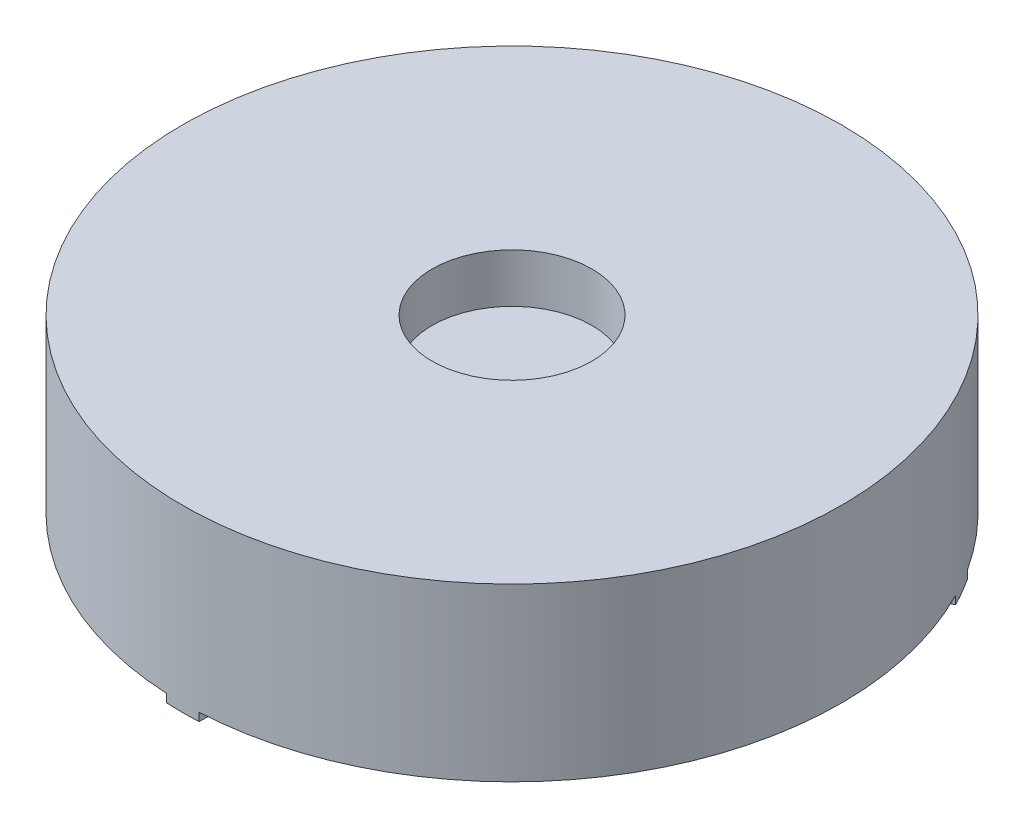
ISO-10303-21;
HEADER;
FILE_DESCRIPTION(('STEP AP214'),'2;1');
FILE_NAME('part.step','',(''),(''),'','','');
FILE_SCHEMA(('AUTOMOTIVE_DESIGN { 1 0 10303 214 1 1 1 1 }'));
ENDSEC;
DATA;
#1=APPLICATION_CONTEXT('core data for automotive mechanical design processes');
#2=APPLICATION_PROTOCOL_DEFINITION('international standard','automotive_design',2000,#1);
#3=PRODUCT_CONTEXT('',#1,'mechanical');
#4=PRODUCT('Part','Part','',(#3));
#5=PRODUCT_RELATED_PRODUCT_CATEGORY('part','',(#4));
#6=PRODUCT_DEFINITION_FORMATION('','',#4);
#7=PRODUCT_DEFINITION_CONTEXT('part definition',#1,'design');
#8=PRODUCT_DEFINITION('design','',#6,#7);
#9=PRODUCT_DEFINITION_SHAPE('','',#8);
#10=(LENGTH_UNIT() NAMED_UNIT(*) SI_UNIT(.MILLI.,.METRE.));
#11=(NAMED_UNIT(*) PLANE_ANGLE_UNIT() SI_UNIT($,.RADIAN.));
#12=(NAMED_UNIT(*) SI_UNIT($,.STERADIAN.) SOLID_ANGLE_UNIT());
#13=UNCERTAINTY_MEASURE_WITH_UNIT(LENGTH_MEASURE(1.E-05),#10,'distance_accuracy_value','');
#14=(GEOMETRIC_REPRESENTATION_CONTEXT(3) GLOBAL_UNCERTAINTY_ASSIGNED_CONTEXT((#13)) GLOBAL_UNIT_ASSIGNED_CONTEXT((#10,
#11,#12)) REPRESENTATION_CONTEXT('',''));
#15=CARTESIAN_POINT('',(0.,0.,0.));
#16=DIRECTION('',(0.,0.,1.));
#17=DIRECTION('',(1.,0.,0.));
#18=AXIS2_PLACEMENT_3D('',#15,#16,#17);
#19=CARTESIAN_POINT('',(0.,0.,-20.2));
#20=DIRECTION('',(0.,-1.,0.));
#21=DIRECTION('',(0.,0.,-1.));
#22=AXIS2_PLACEMENT_3D('',#19,#20,#21);
#23=PLANE('',#22);
#24=CARTESIAN_POINT('',(0.,0.,-14.5));
#25=DIRECTION('',(0.,-1.,0.));
#26=DIRECTION('',(0.,0.,-1.));
#27=AXIS2_PLACEMENT_3D('',#24,#25,#26);
#28=CIRCLE('',#27,0.5);
#29=CARTESIAN_POINT('',(0.,0.,-15.));
#30=VERTEX_POINT('',#29);
#31=EDGE_CURVE('E326',#30,#30,#28,.T.);
#32=ORIENTED_EDGE('',*,*,#31,.F.);
#33=EDGE_LOOP('',(#32));
#34=FACE_BOUND('',#33,.T.);
#35=CARTESIAN_POINT('',(0.,0.,4.));
#36=DIRECTION('',(0.,-1.,0.));
#37=DIRECTION('',(0.,0.,-1.));
#38=AXIS2_PLACEMENT_3D('',#35,#36,#37);
#39=CIRCLE('',#38,0.5);
#40=CARTESIAN_POINT('',(0.,0.,3.5));
#41=VERTEX_POINT('',#40);
#42=EDGE_CURVE('E317',#41,#41,#39,.T.);
#43=ORIENTED_EDGE('',*,*,#42,.F.);
#44=EDGE_LOOP('',(#43));
#45=FACE_BOUND('',#44,.T.);
#46=CARTESIAN_POINT('',(0.,0.,0.));
#47=DIRECTION('',(0.,1.,0.));
#48=DIRECTION('',(0.,0.,-1.));
#49=AXIS2_PLACEMENT_3D('',#46,#47,#48);
#50=CIRCLE('',#49,19.2);
#51=CARTESIAN_POINT('',(-16.1051196924323,0.,-10.452995728136));
#52=VERTEX_POINT('',#51);
#53=CARTESIAN_POINT('',(-17.1051196924323,0.,-8.72094492056709));
#54=VERTEX_POINT('',#53);
#55=EDGE_CURVE('E55',#52,#54,#50,.T.);
#56=ORIENTED_EDGE('',*,*,#55,.F.);
#57=DIRECTION('',(0.866025403784443,0.,0.499999999999992));
#58=VECTOR('',#57,1.);
#59=CARTESIAN_POINT('',(-16.9722637342733,0.,-10.9536415741191));
#60=LINE('',#59,#58);
#61=CARTESIAN_POINT('',(-16.9722637342733,0.,-10.9536415741191));
#62=VERTEX_POINT('',#61);
#63=EDGE_CURVE('E303',#62,#52,#60,.T.);
#64=ORIENTED_EDGE('',*,*,#63,.F.);
#65=CARTESIAN_POINT('',(0.,0.,0.));
#66=DIRECTION('',(0.,-1.,0.));
#67=DIRECTION('',(0.,0.,-1.));
#68=AXIS2_PLACEMENT_3D('',#65,#66,#67);
#69=CIRCLE('',#68,20.2);
#70=CARTESIAN_POINT('',(16.9722637342732,0.,-10.9536415741193));
#71=VERTEX_POINT('',#70);
#72=EDGE_CURVE('E153',#62,#71,#69,.T.);
#73=ORIENTED_EDGE('',*,*,#72,.T.);
#74=DIRECTION('',(0.866025403784436,0.,-0.500000000000005));
#75=VECTOR('',#74,1.);
#76=CARTESIAN_POINT('',(16.9722637342732,0.,-10.9536415741193));
#77=LINE('',#76,#75);
#78=CARTESIAN_POINT('',(16.1051196924322,0.,-10.4529957281362));
#79=VERTEX_POINT('',#78);
#80=EDGE_CURVE('E170',#79,#71,#77,.T.);
#81=ORIENTED_EDGE('',*,*,#80,.F.);
#82=CARTESIAN_POINT('',(0.,0.,0.));
#83=DIRECTION('',(0.,1.,0.));
#84=DIRECTION('',(0.,0.,-1.));
#85=AXIS2_PLACEMENT_3D('',#82,#83,#84);
#86=CIRCLE('',#85,19.2);
#87=CARTESIAN_POINT('',(17.1051196924322,0.,-8.72094492056734));
#88=VERTEX_POINT('',#87);
#89=EDGE_CURVE('E159',#88,#79,#86,.T.);
#90=ORIENTED_EDGE('',*,*,#89,.F.);
#91=DIRECTION('',(-0.866025403784436,0.,0.500000000000005));
#92=VECTOR('',#91,1.);
#93=CARTESIAN_POINT('',(17.9722637342732,0.,-9.22159076655044));
#94=LINE('',#93,#92);
#95=CARTESIAN_POINT('',(17.9722637342732,0.,-9.22159076655044));
#96=VERTEX_POINT('',#95);
#97=EDGE_CURVE('E155',#96,#88,#94,.T.);
#98=ORIENTED_EDGE('',*,*,#97,.F.);
#99=CARTESIAN_POINT('',(1.,0.,20.1752323406696));
#100=VERTEX_POINT('',#99);
#101=EDGE_CURVE('E239',#96,#100,#69,.T.);
#102=ORIENTED_EDGE('',*,*,#101,.T.);
#103=DIRECTION('',(0.,0.,1.));
#104=VECTOR('',#103,1.);
#105=CARTESIAN_POINT('',(1.,0.,20.1752323406696));
#106=LINE('',#105,#104);
#107=CARTESIAN_POINT('',(1.,0.,19.1739406487034));
#108=VERTEX_POINT('',#107);
#109=EDGE_CURVE('E204',#108,#100,#106,.T.);
#110=ORIENTED_EDGE('',*,*,#109,.F.);
#111=CARTESIAN_POINT('',(0.,0.,0.));
#112=DIRECTION('',(0.,1.,0.));
#113=DIRECTION('',(0.,0.,-1.));
#114=AXIS2_PLACEMENT_3D('',#111,#112,#113);
#115=CIRCLE('',#114,19.2);
#116=CARTESIAN_POINT('',(-1.,0.,19.1739406487034));
#117=VERTEX_POINT('',#116);
#118=EDGE_CURVE('E217',#117,#108,#115,.T.);
#119=ORIENTED_EDGE('',*,*,#118,.F.);
#120=DIRECTION('',(0.,0.,-1.));
#121=VECTOR('',#120,1.);
#122=CARTESIAN_POINT('',(-1.,0.,20.1752323406696));
#123=LINE('',#122,#121);
#124=CARTESIAN_POINT('',(-1.,0.,20.1752323406696));
#125=VERTEX_POINT('',#124);
#126=EDGE_CURVE('E198',#125,#117,#123,.T.);
#127=ORIENTED_EDGE('',*,*,#126,.F.);
#128=CARTESIAN_POINT('',(-17.9722637342733,0.,-9.22159076655018));
#129=VERTEX_POINT('',#128);
#130=EDGE_CURVE('E240',#125,#129,#69,.T.);
#131=ORIENTED_EDGE('',*,*,#130,.T.);
#132=DIRECTION('',(-0.866025403784444,0.,-0.499999999999991));
#133=VECTOR('',#132,1.);
#134=CARTESIAN_POINT('',(-17.9722637342733,0.,-9.22159076655018));
#135=LINE('',#134,#133);
#136=EDGE_CURVE('E60',#54,#129,#135,.T.);
#137=ORIENTED_EDGE('',*,*,#136,.F.);
#138=EDGE_LOOP('',(#56,#64,#73,#81,#90,#98,#102,#110,#119,#127,#131,#137));
#139=FACE_BOUND('',#138,.T.);
#140=ADVANCED_FACE('F39',(#34,#45,#139),#23,.T.);
#141=CARTESIAN_POINT('',(0.,7.5,0.));
#142=DIRECTION('',(0.,1.,0.));
#143=DIRECTION('',(0.,0.,1.));
#144=AXIS2_PLACEMENT_3D('',#141,#142,#143);
#145=PLANE('',#144);
#146=CARTESIAN_POINT('',(0.,7.5,0.));
#147=DIRECTION('',(0.,-1.,0.));
#148=DIRECTION('',(0.,0.,-1.));
#149=AXIS2_PLACEMENT_3D('',#146,#147,#148);
#150=CIRCLE('',#149,4.9);
#151=CARTESIAN_POINT('',(0.,7.5,-4.9));
#152=VERTEX_POINT('',#151);
#153=EDGE_CURVE('E11',#152,#152,#150,.T.);
#154=ORIENTED_EDGE('',*,*,#153,.F.);
#155=EDGE_LOOP('',(#154));
#156=FACE_BOUND('',#155,.T.);
#157=ADVANCED_FACE('F41',(#156),#145,.T.);
#158=CARTESIAN_POINT('',(0.,0.,0.));
#159=DIRECTION('',(0.,-1.,0.));
#160=DIRECTION('',(0.,0.,-1.));
#161=AXIS2_PLACEMENT_3D('',#158,#159,#160);
#162=CYLINDRICAL_SURFACE('',#161,4.9);
#163=ORIENTED_EDGE('',*,*,#153,.T.);
#164=EDGE_LOOP('',(#163));
#165=FACE_BOUND('',#164,.T.);
#166=CARTESIAN_POINT('',(0.,10.5,0.));
#167=DIRECTION('',(0.,-1.,0.));
#168=DIRECTION('',(0.,0.,-1.));
#169=AXIS2_PLACEMENT_3D('',#166,#167,#168);
#170=CIRCLE('',#169,4.9);
#171=CARTESIAN_POINT('',(0.,10.5,-4.9));
#172=VERTEX_POINT('',#171);
#173=EDGE_CURVE('E48',#172,#172,#170,.T.);
#174=ORIENTED_EDGE('',*,*,#173,.F.);
#175=EDGE_LOOP('',(#174));
#176=FACE_BOUND('',#175,.T.);
#177=ADVANCED_FACE('F253',(#165,#176),#162,.F.);
#178=CARTESIAN_POINT('',(0.,10.5,-4.9));
#179=DIRECTION('',(0.,1.,0.));
#180=DIRECTION('',(0.,0.,1.));
#181=AXIS2_PLACEMENT_3D('',#178,#179,#180);
#182=PLANE('',#181);
#183=ORIENTED_EDGE('',*,*,#173,.T.);
#184=EDGE_LOOP('',(#183));
#185=FACE_BOUND('',#184,.T.);
#186=CARTESIAN_POINT('',(0.,10.5,0.));
#187=DIRECTION('',(0.,-1.,0.));
#188=DIRECTION('',(0.,0.,-1.));
#189=AXIS2_PLACEMENT_3D('',#186,#187,#188);
#190=CIRCLE('',#189,20.2);
#191=CARTESIAN_POINT('',(0.,10.5,-20.2));
#192=VERTEX_POINT('',#191);
#193=EDGE_CURVE('E243',#192,#192,#190,.T.);
#194=ORIENTED_EDGE('',*,*,#193,.F.);
#195=EDGE_LOOP('',(#194));
#196=FACE_BOUND('',#195,.T.);
#197=ADVANCED_FACE('F250',(#185,#196),#182,.T.);
#198=CARTESIAN_POINT('',(0.,0.,0.));
#199=DIRECTION('',(0.,-1.,0.));
#200=DIRECTION('',(0.,0.,-1.));
#201=AXIS2_PLACEMENT_3D('',#198,#199,#200);
#202=CYLINDRICAL_SURFACE('',#201,20.2);
#203=ORIENTED_EDGE('',*,*,#193,.T.);
#204=EDGE_LOOP('',(#203));
#205=FACE_BOUND('',#204,.T.);
#206=ORIENTED_EDGE('',*,*,#130,.F.);
#207=DIRECTION('',(0.,1.,0.));
#208=VECTOR('',#207,1.);
#209=CARTESIAN_POINT('',(-1.,-0.5,20.1752323406696));
#210=LINE('',#209,#208);
#211=CARTESIAN_POINT('',(-1.,-0.5,20.1752323406696));
#212=VERTEX_POINT('',#211);
#213=EDGE_CURVE('E235',#212,#125,#210,.T.);
#214=ORIENTED_EDGE('',*,*,#213,.F.);
#215=CARTESIAN_POINT('',(0.,-0.5,0.));
#216=DIRECTION('',(0.,-1.,0.));
#217=DIRECTION('',(0.,0.,-1.));
#218=AXIS2_PLACEMENT_3D('',#215,#216,#217);
#219=CIRCLE('',#218,20.2);
#220=CARTESIAN_POINT('',(1.,-0.5,20.1752323406696));
#221=VERTEX_POINT('',#220);
#222=EDGE_CURVE('E199',#221,#212,#219,.T.);
#223=ORIENTED_EDGE('',*,*,#222,.F.);
#224=DIRECTION('',(0.,1.,0.));
#225=VECTOR('',#224,1.);
#226=CARTESIAN_POINT('',(1.,-0.5,20.1752323406696));
#227=LINE('',#226,#225);
#228=EDGE_CURVE('E213',#221,#100,#227,.T.);
#229=ORIENTED_EDGE('',*,*,#228,.T.);
#230=ORIENTED_EDGE('',*,*,#101,.F.);
#231=DIRECTION('',(0.,1.,0.));
#232=VECTOR('',#231,1.);
#233=CARTESIAN_POINT('',(17.9722637342732,-0.5,-9.22159076655044));
#234=LINE('',#233,#232);
#235=CARTESIAN_POINT('',(17.9722637342732,-0.5,-9.22159076655044));
#236=VERTEX_POINT('',#235);
#237=EDGE_CURVE('E195',#236,#96,#234,.T.);
#238=ORIENTED_EDGE('',*,*,#237,.F.);
#239=CARTESIAN_POINT('',(0.,-0.5,0.));
#240=DIRECTION('',(0.,-1.,0.));
#241=DIRECTION('',(0.,0.,-1.));
#242=AXIS2_PLACEMENT_3D('',#239,#240,#241);
#243=CIRCLE('',#242,20.2);
#244=CARTESIAN_POINT('',(16.9722637342732,-0.5,-10.9536415741193));
#245=VERTEX_POINT('',#244);
#246=EDGE_CURVE('E165',#245,#236,#243,.T.);
#247=ORIENTED_EDGE('',*,*,#246,.F.);
#248=DIRECTION('',(0.,1.,0.));
#249=VECTOR('',#248,1.);
#250=CARTESIAN_POINT('',(16.9722637342732,-0.5,-10.9536415741193));
#251=LINE('',#250,#249);
#252=EDGE_CURVE('E178',#245,#71,#251,.T.);
#253=ORIENTED_EDGE('',*,*,#252,.T.);
#254=ORIENTED_EDGE('',*,*,#72,.F.);
#255=DIRECTION('',(0.,1.,0.));
#256=VECTOR('',#255,1.);
#257=CARTESIAN_POINT('',(-16.9722637342733,-0.5,-10.9536415741191));
#258=LINE('',#257,#256);
#259=CARTESIAN_POINT('',(-16.9722637342733,-0.5,-10.9536415741191));
#260=VERTEX_POINT('',#259);
#261=EDGE_CURVE('E132',#260,#62,#258,.T.);
#262=ORIENTED_EDGE('',*,*,#261,.F.);
#263=CARTESIAN_POINT('',(0.,-0.5,0.));
#264=DIRECTION('',(0.,-1.,0.));
#265=DIRECTION('',(0.,0.,-1.));
#266=AXIS2_PLACEMENT_3D('',#263,#264,#265);
#267=CIRCLE('',#266,20.2);
#268=CARTESIAN_POINT('',(-17.9722637342733,-0.5,-9.22159076655018));
#269=VERTEX_POINT('',#268);
#270=EDGE_CURVE('E139',#269,#260,#267,.T.);
#271=ORIENTED_EDGE('',*,*,#270,.F.);
#272=DIRECTION('',(0.,1.,0.));
#273=VECTOR('',#272,1.);
#274=CARTESIAN_POINT('',(-17.9722637342733,-0.5,-9.22159076655018));
#275=LINE('',#274,#273);
#276=EDGE_CURVE('E295',#269,#129,#275,.T.);
#277=ORIENTED_EDGE('',*,*,#276,.T.);
#278=EDGE_LOOP('',(#206,#214,#223,#229,#230,#238,#247,#253,#254,#262,#271,#277));
#279=FACE_BOUND('',#278,.T.);
#280=ADVANCED_FACE('F151',(#205,#279),#202,.T.);
#281=CARTESIAN_POINT('',(-1.,-0.5,20.1752323406696));
#282=DIRECTION('',(1.,0.,0.));
#283=DIRECTION('',(0.,0.,-1.));
#284=AXIS2_PLACEMENT_3D('',#281,#282,#283);
#285=PLANE('',#284);
#286=ORIENTED_EDGE('',*,*,#126,.T.);
#287=DIRECTION('',(0.,1.,0.));
#288=VECTOR('',#287,1.);
#289=CARTESIAN_POINT('',(-1.,-0.5,19.1739406487034));
#290=LINE('',#289,#288);
#291=CARTESIAN_POINT('',(-1.,-0.5,19.1739406487034));
#292=VERTEX_POINT('',#291);
#293=EDGE_CURVE('E231',#292,#117,#290,.T.);
#294=ORIENTED_EDGE('',*,*,#293,.F.);
#295=DIRECTION('',(0.,0.,-1.));
#296=VECTOR('',#295,1.);
#297=CARTESIAN_POINT('',(-1.,-0.5,20.1752323406696));
#298=LINE('',#297,#296);
#299=EDGE_CURVE('E203',#212,#292,#298,.T.);
#300=ORIENTED_EDGE('',*,*,#299,.F.);
#301=ORIENTED_EDGE('',*,*,#213,.T.);
#302=EDGE_LOOP('',(#286,#294,#300,#301));
#303=FACE_BOUND('',#302,.T.);
#304=ADVANCED_FACE('F271',(#303),#285,.F.);
#305=CARTESIAN_POINT('',(0.,-0.5,0.));
#306=DIRECTION('',(0.,1.,0.));
#307=DIRECTION('',(0.,0.,1.));
#308=AXIS2_PLACEMENT_3D('',#305,#306,#307);
#309=CYLINDRICAL_SURFACE('',#308,19.2);
#310=ORIENTED_EDGE('',*,*,#118,.T.);
#311=DIRECTION('',(0.,1.,0.));
#312=VECTOR('',#311,1.);
#313=CARTESIAN_POINT('',(1.,-0.5,19.1739406487034));
#314=LINE('',#313,#312);
#315=CARTESIAN_POINT('',(1.,-0.5,19.1739406487034));
#316=VERTEX_POINT('',#315);
#317=EDGE_CURVE('E227',#316,#108,#314,.T.);
#318=ORIENTED_EDGE('',*,*,#317,.F.);
#319=CARTESIAN_POINT('',(0.,-0.5,0.));
#320=DIRECTION('',(0.,1.,0.));
#321=DIRECTION('',(0.,0.,-1.));
#322=AXIS2_PLACEMENT_3D('',#319,#320,#321);
#323=CIRCLE('',#322,19.2);
#324=EDGE_CURVE('E207',#292,#316,#323,.T.);
#325=ORIENTED_EDGE('',*,*,#324,.F.);
#326=ORIENTED_EDGE('',*,*,#293,.T.);
#327=EDGE_LOOP('',(#310,#318,#325,#326));
#328=FACE_BOUND('',#327,.T.);
#329=ADVANCED_FACE('F278',(#328),#309,.F.);
#330=CARTESIAN_POINT('',(1.,-0.5,20.1752323406696));
#331=DIRECTION('',(-1.,0.,0.));
#332=DIRECTION('',(0.,0.,1.));
#333=AXIS2_PLACEMENT_3D('',#330,#331,#332);
#334=PLANE('',#333);
#335=ORIENTED_EDGE('',*,*,#109,.T.);
#336=ORIENTED_EDGE('',*,*,#228,.F.);
#337=DIRECTION('',(0.,0.,1.));
#338=VECTOR('',#337,1.);
#339=CARTESIAN_POINT('',(1.,-0.5,20.1752323406696));
#340=LINE('',#339,#338);
#341=EDGE_CURVE('E210',#316,#221,#340,.T.);
#342=ORIENTED_EDGE('',*,*,#341,.F.);
#343=ORIENTED_EDGE('',*,*,#317,.T.);
#344=EDGE_LOOP('',(#335,#336,#342,#343));
#345=FACE_BOUND('',#344,.T.);
#346=ADVANCED_FACE('F284',(#345),#334,.F.);
#347=CARTESIAN_POINT('',(0.,-0.5,0.));
#348=DIRECTION('',(0.,-1.,0.));
#349=DIRECTION('',(0.,0.,-1.));
#350=AXIS2_PLACEMENT_3D('',#347,#348,#349);
#351=PLANE('',#350);
#352=ORIENTED_EDGE('',*,*,#222,.T.);
#353=ORIENTED_EDGE('',*,*,#299,.T.);
#354=ORIENTED_EDGE('',*,*,#324,.T.);
#355=ORIENTED_EDGE('',*,*,#341,.T.);
#356=EDGE_LOOP('',(#352,#353,#354,#355));
#357=FACE_BOUND('',#356,.T.);
#358=ADVANCED_FACE('F292',(#357),#351,.T.);
#359=CARTESIAN_POINT('',(17.9722637342732,-0.5,-9.22159076655044));
#360=DIRECTION('',(-0.500000000000005,0.,-0.866025403784436));
#361=DIRECTION('',(-0.866025403784436,0.,0.500000000000005));
#362=AXIS2_PLACEMENT_3D('',#359,#360,#361);
#363=PLANE('',#362);
#364=ORIENTED_EDGE('',*,*,#97,.T.);
#365=DIRECTION('',(0.,1.,0.));
#366=VECTOR('',#365,1.);
#367=CARTESIAN_POINT('',(17.1051196924322,-0.5,-8.72094492056734));
#368=LINE('',#367,#366);
#369=CARTESIAN_POINT('',(17.1051196924322,-0.5,-8.72094492056734));
#370=VERTEX_POINT('',#369);
#371=EDGE_CURVE('E191',#370,#88,#368,.T.);
#372=ORIENTED_EDGE('',*,*,#371,.F.);
#373=DIRECTION('',(-0.866025403784436,0.,0.500000000000005));
#374=VECTOR('',#373,1.);
#375=CARTESIAN_POINT('',(17.9722637342732,-0.5,-9.22159076655044));
#376=LINE('',#375,#374);
#377=EDGE_CURVE('E169',#236,#370,#376,.T.);
#378=ORIENTED_EDGE('',*,*,#377,.F.);
#379=ORIENTED_EDGE('',*,*,#237,.T.);
#380=EDGE_LOOP('',(#364,#372,#378,#379));
#381=FACE_BOUND('',#380,.T.);
#382=ADVANCED_FACE('F373',(#381),#363,.F.);
#383=CARTESIAN_POINT('',(0.,-0.5,0.));
#384=DIRECTION('',(0.,1.,0.));
#385=DIRECTION('',(0.,0.,1.));
#386=AXIS2_PLACEMENT_3D('',#383,#384,#385);
#387=CYLINDRICAL_SURFACE('',#386,19.2);
#388=ORIENTED_EDGE('',*,*,#89,.T.);
#389=DIRECTION('',(0.,1.,0.));
#390=VECTOR('',#389,1.);
#391=CARTESIAN_POINT('',(16.1051196924322,-0.5,-10.4529957281362));
#392=LINE('',#391,#390);
#393=CARTESIAN_POINT('',(16.1051196924322,-0.5,-10.4529957281362));
#394=VERTEX_POINT('',#393);
#395=EDGE_CURVE('E188',#394,#79,#392,.T.);
#396=ORIENTED_EDGE('',*,*,#395,.F.);
#397=CARTESIAN_POINT('',(0.,-0.5,0.));
#398=DIRECTION('',(0.,1.,0.));
#399=DIRECTION('',(0.,0.,-1.));
#400=AXIS2_PLACEMENT_3D('',#397,#398,#399);
#401=CIRCLE('',#400,19.2);
#402=EDGE_CURVE('E173',#370,#394,#401,.T.);
#403=ORIENTED_EDGE('',*,*,#402,.F.);
#404=ORIENTED_EDGE('',*,*,#371,.T.);
#405=EDGE_LOOP('',(#388,#396,#403,#404));
#406=FACE_BOUND('',#405,.T.);
#407=ADVANCED_FACE('F369',(#406),#387,.F.);
#408=CARTESIAN_POINT('',(16.9722637342732,-0.5,-10.9536415741193));
#409=DIRECTION('',(0.500000000000005,0.,0.866025403784436));
#410=DIRECTION('',(0.866025403784436,0.,-0.500000000000005));
#411=AXIS2_PLACEMENT_3D('',#408,#409,#410);
#412=PLANE('',#411);
#413=ORIENTED_EDGE('',*,*,#80,.T.);
#414=ORIENTED_EDGE('',*,*,#252,.F.);
#415=DIRECTION('',(0.866025403784436,0.,-0.500000000000005));
#416=VECTOR('',#415,1.);
#417=CARTESIAN_POINT('',(16.9722637342732,-0.5,-10.9536415741193));
#418=LINE('',#417,#416);
#419=EDGE_CURVE('E176',#394,#245,#418,.T.);
#420=ORIENTED_EDGE('',*,*,#419,.F.);
#421=ORIENTED_EDGE('',*,*,#395,.T.);
#422=EDGE_LOOP('',(#413,#414,#420,#421));
#423=FACE_BOUND('',#422,.T.);
#424=ADVANCED_FACE('F365',(#423),#412,.F.);
#425=CARTESIAN_POINT('',(0.,-0.5,0.));
#426=DIRECTION('',(0.,-1.,0.));
#427=DIRECTION('',(0.,0.,-1.));
#428=AXIS2_PLACEMENT_3D('',#425,#426,#427);
#429=PLANE('',#428);
#430=ORIENTED_EDGE('',*,*,#246,.T.);
#431=ORIENTED_EDGE('',*,*,#377,.T.);
#432=ORIENTED_EDGE('',*,*,#402,.T.);
#433=ORIENTED_EDGE('',*,*,#419,.T.);
#434=EDGE_LOOP('',(#430,#431,#432,#433));
#435=FACE_BOUND('',#434,.T.);
#436=ADVANCED_FACE('F362',(#435),#429,.T.);
#437=CARTESIAN_POINT('',(-16.9722637342733,-0.5,-10.9536415741191));
#438=DIRECTION('',(-0.499999999999992,0.,0.866025403784444));
#439=DIRECTION('',(0.866025403784444,0.,0.499999999999992));
#440=AXIS2_PLACEMENT_3D('',#437,#438,#439);
#441=PLANE('',#440);
#442=ORIENTED_EDGE('',*,*,#63,.T.);
#443=DIRECTION('',(0.,1.,0.));
#444=VECTOR('',#443,1.);
#445=CARTESIAN_POINT('',(-16.1051196924323,-0.5,-10.452995728136));
#446=LINE('',#445,#444);
#447=CARTESIAN_POINT('',(-16.1051196924323,-0.5,-10.452995728136));
#448=VERTEX_POINT('',#447);
#449=EDGE_CURVE('E134',#448,#52,#446,.T.);
#450=ORIENTED_EDGE('',*,*,#449,.F.);
#451=DIRECTION('',(0.866025403784443,0.,0.499999999999992));
#452=VECTOR('',#451,1.);
#453=CARTESIAN_POINT('',(-16.9722637342733,-0.5,-10.9536415741191));
#454=LINE('',#453,#452);
#455=EDGE_CURVE('E128',#260,#448,#454,.T.);
#456=ORIENTED_EDGE('',*,*,#455,.F.);
#457=ORIENTED_EDGE('',*,*,#261,.T.);
#458=EDGE_LOOP('',(#442,#450,#456,#457));
#459=FACE_BOUND('',#458,.T.);
#460=ADVANCED_FACE('F130',(#459),#441,.F.);
#461=CARTESIAN_POINT('',(0.,-0.5,0.));
#462=DIRECTION('',(0.,1.,0.));
#463=DIRECTION('',(0.,0.,1.));
#464=AXIS2_PLACEMENT_3D('',#461,#462,#463);
#465=CYLINDRICAL_SURFACE('',#464,19.2);
#466=ORIENTED_EDGE('',*,*,#55,.T.);
#467=DIRECTION('',(0.,1.,0.));
#468=VECTOR('',#467,1.);
#469=CARTESIAN_POINT('',(-17.1051196924323,-0.5,-8.72094492056709));
#470=LINE('',#469,#468);
#471=CARTESIAN_POINT('',(-17.1051196924323,-0.5,-8.72094492056709));
#472=VERTEX_POINT('',#471);
#473=EDGE_CURVE('E161',#472,#54,#470,.T.);
#474=ORIENTED_EDGE('',*,*,#473,.F.);
#475=CARTESIAN_POINT('',(0.,-0.5,0.));
#476=DIRECTION('',(0.,1.,0.));
#477=DIRECTION('',(0.,0.,-1.));
#478=AXIS2_PLACEMENT_3D('',#475,#476,#477);
#479=CIRCLE('',#478,19.2);
#480=EDGE_CURVE('E138',#448,#472,#479,.T.);
#481=ORIENTED_EDGE('',*,*,#480,.F.);
#482=ORIENTED_EDGE('',*,*,#449,.T.);
#483=EDGE_LOOP('',(#466,#474,#481,#482));
#484=FACE_BOUND('',#483,.T.);
#485=ADVANCED_FACE('F356',(#484),#465,.F.);
#486=CARTESIAN_POINT('',(-17.9722637342733,-0.5,-9.22159076655018));
#487=DIRECTION('',(0.499999999999991,0.,-0.866025403784444));
#488=DIRECTION('',(-0.866025403784444,0.,-0.499999999999991));
#489=AXIS2_PLACEMENT_3D('',#486,#487,#488);
#490=PLANE('',#489);
#491=ORIENTED_EDGE('',*,*,#136,.T.);
#492=ORIENTED_EDGE('',*,*,#276,.F.);
#493=DIRECTION('',(-0.866025403784444,0.,-0.499999999999991));
#494=VECTOR('',#493,1.);
#495=CARTESIAN_POINT('',(-17.9722637342733,-0.5,-9.22159076655018));
#496=LINE('',#495,#494);
#497=EDGE_CURVE('E144',#472,#269,#496,.T.);
#498=ORIENTED_EDGE('',*,*,#497,.F.);
#499=ORIENTED_EDGE('',*,*,#473,.T.);
#500=EDGE_LOOP('',(#491,#492,#498,#499));
#501=FACE_BOUND('',#500,.T.);
#502=ADVANCED_FACE('F298',(#501),#490,.F.);
#503=CARTESIAN_POINT('',(0.,-0.5,0.));
#504=DIRECTION('',(0.,-1.,0.));
#505=DIRECTION('',(0.,0.,-1.));
#506=AXIS2_PLACEMENT_3D('',#503,#504,#505);
#507=PLANE('',#506);
#508=ORIENTED_EDGE('',*,*,#270,.T.);
#509=ORIENTED_EDGE('',*,*,#455,.T.);
#510=ORIENTED_EDGE('',*,*,#480,.T.);
#511=ORIENTED_EDGE('',*,*,#497,.T.);
#512=EDGE_LOOP('',(#508,#509,#510,#511));
#513=FACE_BOUND('',#512,.T.);
#514=ADVANCED_FACE('F142',(#513),#507,.T.);
#515=CARTESIAN_POINT('',(0.,-3.1,4.));
#516=DIRECTION('',(0.,1.,0.));
#517=DIRECTION('',(0.,0.,1.));
#518=AXIS2_PLACEMENT_3D('',#515,#516,#517);
#519=CYLINDRICAL_SURFACE('',#518,0.5);
#520=CARTESIAN_POINT('',(0.,-3.1,4.));
#521=DIRECTION('',(0.,-1.,0.));
#522=DIRECTION('',(0.,0.,-1.));
#523=AXIS2_PLACEMENT_3D('',#520,#521,#522);
#524=CIRCLE('',#523,0.5);
#525=CARTESIAN_POINT('',(0.,-3.1,3.5));
#526=VERTEX_POINT('',#525);
#527=EDGE_CURVE('E314',#526,#526,#524,.T.);
#528=ORIENTED_EDGE('',*,*,#527,.F.);
#529=EDGE_LOOP('',(#528));
#530=FACE_BOUND('',#529,.T.);
#531=ORIENTED_EDGE('',*,*,#42,.T.);
#532=EDGE_LOOP('',(#531));
#533=FACE_BOUND('',#532,.T.);
#534=ADVANCED_FACE('F346',(#530,#533),#519,.T.);
#535=CARTESIAN_POINT('',(0.,-3.1,4.));
#536=DIRECTION('',(0.,-1.,0.));
#537=DIRECTION('',(0.,0.,-1.));
#538=AXIS2_PLACEMENT_3D('',#535,#536,#537);
#539=PLANE('',#538);
#540=ORIENTED_EDGE('',*,*,#527,.T.);
#541=EDGE_LOOP('',(#540));
#542=FACE_BOUND('',#541,.T.);
#543=ADVANCED_FACE('F339',(#542),#539,.T.);
#544=CARTESIAN_POINT('',(0.,-3.1,-14.5));
#545=DIRECTION('',(0.,1.,0.));
#546=DIRECTION('',(0.,0.,1.));
#547=AXIS2_PLACEMENT_3D('',#544,#545,#546);
#548=CYLINDRICAL_SURFACE('',#547,0.5);
#549=CARTESIAN_POINT('',(0.,-3.1,-14.5));
#550=DIRECTION('',(0.,-1.,0.));
#551=DIRECTION('',(0.,0.,-1.));
#552=AXIS2_PLACEMENT_3D('',#549,#550,#551);
#553=CIRCLE('',#552,0.5);
#554=CARTESIAN_POINT('',(0.,-3.1,-15.));
#555=VERTEX_POINT('',#554);
#556=EDGE_CURVE('E323',#555,#555,#553,.T.);
#557=ORIENTED_EDGE('',*,*,#556,.F.);
#558=EDGE_LOOP('',(#557));
#559=FACE_BOUND('',#558,.T.);
#560=ORIENTED_EDGE('',*,*,#31,.T.);
#561=EDGE_LOOP('',(#560));
#562=FACE_BOUND('',#561,.T.);
#563=ADVANCED_FACE('F336',(#559,#562),#548,.T.);
#564=CARTESIAN_POINT('',(0.,-3.1,-14.5));
#565=DIRECTION('',(0.,-1.,0.));
#566=DIRECTION('',(0.,0.,-1.));
#567=AXIS2_PLACEMENT_3D('',#564,#565,#566);
#568=PLANE('',#567);
#569=ORIENTED_EDGE('',*,*,#556,.T.);
#570=EDGE_LOOP('',(#569));
#571=FACE_BOUND('',#570,.T.);
#572=ADVANCED_FACE('F334',(#571),#568,.T.);
#573=CLOSED_SHELL('',(#140,#157,#177,#197,#280,#304,#329,#346,#358,#382,#407,#424,#436,#460,
#485,#502,#514,#534,#543,#563,#572));
#574=MANIFOLD_SOLID_BREP('B2',#573);
#575=ADVANCED_BREP_SHAPE_REPRESENTATION('',(#18,#574),#14);
#576=SHAPE_DEFINITION_REPRESENTATION(#9,#575);
ENDSEC;
END-ISO-10303-21;
